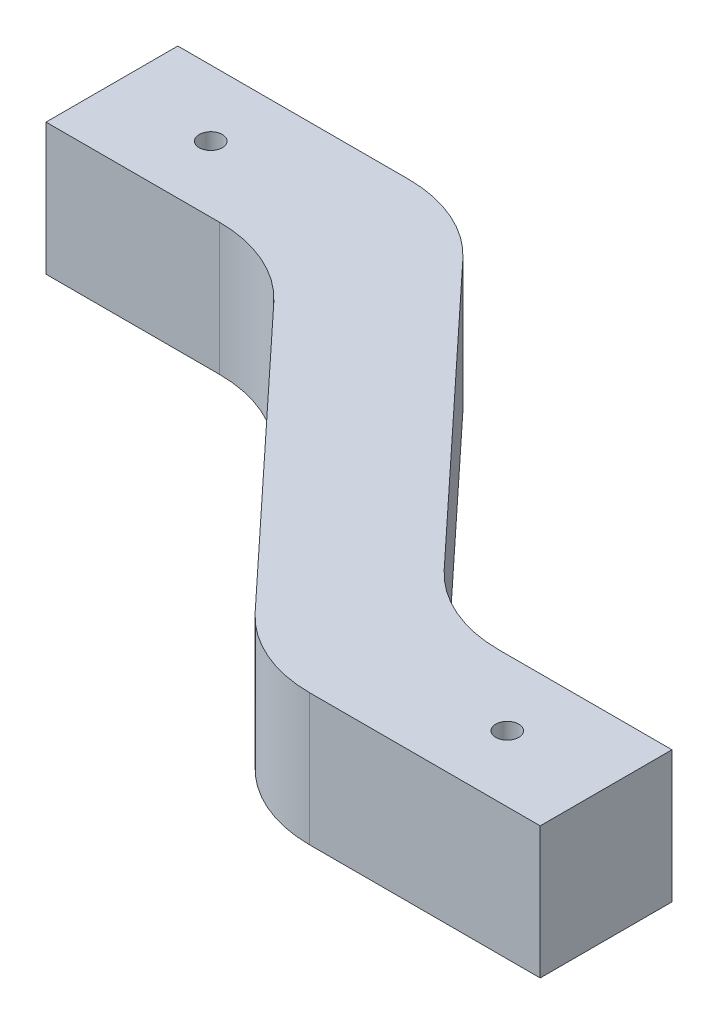
ISO-10303-21;
HEADER;
FILE_DESCRIPTION(('STEP AP214'),'2;1');
FILE_NAME('part.step','',(''),(''),'','','');
FILE_SCHEMA(('AUTOMOTIVE_DESIGN { 1 0 10303 214 1 1 1 1 }'));
ENDSEC;
DATA;
#1=APPLICATION_CONTEXT('core data for automotive mechanical design processes');
#2=APPLICATION_PROTOCOL_DEFINITION('international standard','automotive_design',2000,#1);
#3=PRODUCT_CONTEXT('',#1,'mechanical');
#4=PRODUCT('Part','Part','',(#3));
#5=PRODUCT_RELATED_PRODUCT_CATEGORY('part','',(#4));
#6=PRODUCT_DEFINITION_FORMATION('','',#4);
#7=PRODUCT_DEFINITION_CONTEXT('part definition',#1,'design');
#8=PRODUCT_DEFINITION('design','',#6,#7);
#9=PRODUCT_DEFINITION_SHAPE('','',#8);
#10=(LENGTH_UNIT() NAMED_UNIT(*) SI_UNIT(.MILLI.,.METRE.));
#11=(NAMED_UNIT(*) PLANE_ANGLE_UNIT() SI_UNIT($,.RADIAN.));
#12=(NAMED_UNIT(*) SI_UNIT($,.STERADIAN.) SOLID_ANGLE_UNIT());
#13=UNCERTAINTY_MEASURE_WITH_UNIT(LENGTH_MEASURE(1.E-05),#10,'distance_accuracy_value','');
#14=(GEOMETRIC_REPRESENTATION_CONTEXT(3) GLOBAL_UNCERTAINTY_ASSIGNED_CONTEXT((#13)) GLOBAL_UNIT_ASSIGNED_CONTEXT((#10,
#11,#12)) REPRESENTATION_CONTEXT('',''));
#15=CARTESIAN_POINT('',(0.,0.,0.));
#16=DIRECTION('',(0.,0.,1.));
#17=DIRECTION('',(1.,0.,0.));
#18=AXIS2_PLACEMENT_3D('',#15,#16,#17);
#19=CARTESIAN_POINT('',(0.,20.,0.));
#20=DIRECTION('',(0.,-1.,0.));
#21=DIRECTION('',(0.,0.,-1.));
#22=AXIS2_PLACEMENT_3D('',#19,#20,#21);
#23=PLANE('',#22);
#24=DIRECTION('',(0.682122364496378,0.,0.73123804595622));
#25=VECTOR('',#24,1.);
#26=CARTESIAN_POINT('',(21.3057686956662,20.,75.));
#27=LINE('',#26,#25);
#28=CARTESIAN_POINT('',(-24.0694703852094,20.,26.3575527100725));
#29=VERTEX_POINT('',#28);
#30=CARTESIAN_POINT('',(15.3752390808756,20.,68.6424472899275));
#31=VERTEX_POINT('',#30);
#32=EDGE_CURVE('E139',#29,#31,#27,.T.);
#33=ORIENTED_EDGE('',*,*,#32,.T.);
#34=CARTESIAN_POINT('',(30.,20.,55.));
#35=DIRECTION('',(0.,-1.,0.));
#36=DIRECTION('',(0.,0.,-1.));
#37=AXIS2_PLACEMENT_3D('',#34,#35,#36);
#38=CIRCLE('',#37,20.);
#39=CARTESIAN_POINT('',(30.,20.,75.));
#40=VERTEX_POINT('',#39);
#41=EDGE_CURVE('E174',#31,#40,#38,.F.);
#42=ORIENTED_EDGE('',*,*,#41,.T.);
#43=DIRECTION('',(1.,0.,0.));
#44=VECTOR('',#43,1.);
#45=CARTESIAN_POINT('',(65.,20.,75.));
#46=LINE('',#45,#44);
#47=CARTESIAN_POINT('',(65.,20.,75.));
#48=VERTEX_POINT('',#47);
#49=EDGE_CURVE('E205',#40,#48,#46,.T.);
#50=ORIENTED_EDGE('',*,*,#49,.T.);
#51=DIRECTION('',(0.,0.,-1.));
#52=VECTOR('',#51,1.);
#53=CARTESIAN_POINT('',(65.,20.,55.));
#54=LINE('',#53,#52);
#55=CARTESIAN_POINT('',(65.,20.,55.));
#56=VERTEX_POINT('',#55);
#57=EDGE_CURVE('E207',#48,#56,#54,.T.);
#58=ORIENTED_EDGE('',*,*,#57,.T.);
#59=DIRECTION('',(-1.,0.,0.));
#60=VECTOR('',#59,1.);
#61=CARTESIAN_POINT('',(30.,20.,55.));
#62=LINE('',#61,#60);
#63=CARTESIAN_POINT('',(38.6942313043338,20.,55.));
#64=VERTEX_POINT('',#63);
#65=EDGE_CURVE('E211',#56,#64,#62,.T.);
#66=ORIENTED_EDGE('',*,*,#65,.T.);
#67=CARTESIAN_POINT('',(38.6942313043338,20.,35.));
#68=DIRECTION('',(0.,-1.,0.));
#69=DIRECTION('',(0.,0.,-1.));
#70=AXIS2_PLACEMENT_3D('',#67,#68,#69);
#71=CIRCLE('',#70,20.);
#72=CARTESIAN_POINT('',(24.0694703852094,20.,48.6424472899275));
#73=VERTEX_POINT('',#72);
#74=EDGE_CURVE('E188',#64,#73,#71,.T.);
#75=ORIENTED_EDGE('',*,*,#74,.T.);
#76=DIRECTION('',(-0.682122364496378,0.,-0.73123804595622));
#77=VECTOR('',#76,1.);
#78=CARTESIAN_POINT('',(-21.3057686956662,20.,0.));
#79=LINE('',#78,#77);
#80=CARTESIAN_POINT('',(-15.3752390808756,20.,6.35755271007245));
#81=VERTEX_POINT('',#80);
#82=EDGE_CURVE('E214',#73,#81,#79,.T.);
#83=ORIENTED_EDGE('',*,*,#82,.T.);
#84=CARTESIAN_POINT('',(-30.,20.,20.));
#85=DIRECTION('',(0.,-1.,0.));
#86=DIRECTION('',(0.,0.,-1.));
#87=AXIS2_PLACEMENT_3D('',#84,#85,#86);
#88=CIRCLE('',#87,20.);
#89=CARTESIAN_POINT('',(-30.,20.,0.));
#90=VERTEX_POINT('',#89);
#91=EDGE_CURVE('E54',#81,#90,#88,.F.);
#92=ORIENTED_EDGE('',*,*,#91,.T.);
#93=DIRECTION('',(-1.,0.,0.));
#94=VECTOR('',#93,1.);
#95=CARTESIAN_POINT('',(-65.,20.,0.));
#96=LINE('',#95,#94);
#97=CARTESIAN_POINT('',(-65.,20.,0.));
#98=VERTEX_POINT('',#97);
#99=EDGE_CURVE('E145',#90,#98,#96,.T.);
#100=ORIENTED_EDGE('',*,*,#99,.T.);
#101=DIRECTION('',(0.,0.,1.));
#102=VECTOR('',#101,1.);
#103=CARTESIAN_POINT('',(-65.,20.,20.));
#104=LINE('',#103,#102);
#105=CARTESIAN_POINT('',(-65.,20.,20.));
#106=VERTEX_POINT('',#105);
#107=EDGE_CURVE('E140',#98,#106,#104,.T.);
#108=ORIENTED_EDGE('',*,*,#107,.T.);
#109=DIRECTION('',(1.,0.,0.));
#110=VECTOR('',#109,1.);
#111=CARTESIAN_POINT('',(-30.,20.,20.));
#112=LINE('',#111,#110);
#113=CARTESIAN_POINT('',(-38.6942313043338,20.,20.));
#114=VERTEX_POINT('',#113);
#115=EDGE_CURVE('E129',#106,#114,#112,.T.);
#116=ORIENTED_EDGE('',*,*,#115,.T.);
#117=CARTESIAN_POINT('',(-38.6942313043338,20.,40.));
#118=DIRECTION('',(0.,-1.,0.));
#119=DIRECTION('',(0.,0.,-1.));
#120=AXIS2_PLACEMENT_3D('',#117,#118,#119);
#121=CIRCLE('',#120,20.);
#122=EDGE_CURVE('E11',#114,#29,#121,.T.);
#123=ORIENTED_EDGE('',*,*,#122,.T.);
#124=EDGE_LOOP('',(#33,#42,#50,#58,#66,#75,#83,#92,#100,#108,#116,#123));
#125=FACE_BOUND('',#124,.T.);
#126=CARTESIAN_POINT('',(-50.,20.,10.));
#127=DIRECTION('',(0.,1.,0.));
#128=DIRECTION('',(0.,0.,1.));
#129=AXIS2_PLACEMENT_3D('',#126,#127,#128);
#130=CIRCLE('',#129,1.75);
#131=CARTESIAN_POINT('',(-50.,20.,11.75));
#132=VERTEX_POINT('',#131);
#133=EDGE_CURVE('E218',#132,#132,#130,.T.);
#134=ORIENTED_EDGE('',*,*,#133,.F.);
#135=EDGE_LOOP('',(#134));
#136=FACE_BOUND('',#135,.T.);
#137=CARTESIAN_POINT('',(50.,20.,65.));
#138=DIRECTION('',(0.,1.,0.));
#139=DIRECTION('',(0.,0.,1.));
#140=AXIS2_PLACEMENT_3D('',#137,#138,#139);
#141=CIRCLE('',#140,1.75);
#142=CARTESIAN_POINT('',(50.,20.,66.75));
#143=VERTEX_POINT('',#142);
#144=EDGE_CURVE('E283',#143,#143,#141,.T.);
#145=ORIENTED_EDGE('',*,*,#144,.F.);
#146=EDGE_LOOP('',(#145));
#147=FACE_BOUND('',#146,.T.);
#148=ADVANCED_FACE('F39',(#125,#136,#147),#23,.F.);
#149=CARTESIAN_POINT('',(0.,0.,0.));
#150=DIRECTION('',(0.,-1.,0.));
#151=DIRECTION('',(0.,0.,-1.));
#152=AXIS2_PLACEMENT_3D('',#149,#150,#151);
#153=PLANE('',#152);
#154=CARTESIAN_POINT('',(-50.,0.,10.));
#155=DIRECTION('',(0.,1.,0.));
#156=DIRECTION('',(0.,0.,1.));
#157=AXIS2_PLACEMENT_3D('',#154,#155,#156);
#158=CIRCLE('',#157,1.75);
#159=CARTESIAN_POINT('',(-50.,0.,11.75));
#160=VERTEX_POINT('',#159);
#161=EDGE_CURVE('E288',#160,#160,#158,.T.);
#162=ORIENTED_EDGE('',*,*,#161,.T.);
#163=EDGE_LOOP('',(#162));
#164=FACE_BOUND('',#163,.T.);
#165=DIRECTION('',(1.,0.,0.));
#166=VECTOR('',#165,1.);
#167=CARTESIAN_POINT('',(65.,0.,75.));
#168=LINE('',#167,#166);
#169=CARTESIAN_POINT('',(30.,0.,75.));
#170=VERTEX_POINT('',#169);
#171=CARTESIAN_POINT('',(65.,0.,75.));
#172=VERTEX_POINT('',#171);
#173=EDGE_CURVE('E221',#170,#172,#168,.T.);
#174=ORIENTED_EDGE('',*,*,#173,.F.);
#175=CARTESIAN_POINT('',(30.,0.,55.));
#176=DIRECTION('',(0.,-1.,0.));
#177=DIRECTION('',(0.,0.,-1.));
#178=AXIS2_PLACEMENT_3D('',#175,#176,#177);
#179=CIRCLE('',#178,20.);
#180=CARTESIAN_POINT('',(15.3752390808756,0.,68.6424472899275));
#181=VERTEX_POINT('',#180);
#182=EDGE_CURVE('E166',#170,#181,#179,.T.);
#183=ORIENTED_EDGE('',*,*,#182,.T.);
#184=DIRECTION('',(0.682122364496378,0.,0.73123804595622));
#185=VECTOR('',#184,1.);
#186=CARTESIAN_POINT('',(21.3057686956662,0.,75.));
#187=LINE('',#186,#185);
#188=CARTESIAN_POINT('',(-24.0694703852094,0.,26.3575527100725));
#189=VERTEX_POINT('',#188);
#190=EDGE_CURVE('E196',#189,#181,#187,.T.);
#191=ORIENTED_EDGE('',*,*,#190,.F.);
#192=CARTESIAN_POINT('',(-38.6942313043338,0.,40.));
#193=DIRECTION('',(0.,-1.,0.));
#194=DIRECTION('',(0.,0.,-1.));
#195=AXIS2_PLACEMENT_3D('',#192,#193,#194);
#196=CIRCLE('',#195,20.);
#197=CARTESIAN_POINT('',(-38.6942313043338,0.,20.));
#198=VERTEX_POINT('',#197);
#199=EDGE_CURVE('E47',#189,#198,#196,.F.);
#200=ORIENTED_EDGE('',*,*,#199,.T.);
#201=DIRECTION('',(1.,0.,0.));
#202=VECTOR('',#201,1.);
#203=CARTESIAN_POINT('',(-30.,0.,20.));
#204=LINE('',#203,#202);
#205=CARTESIAN_POINT('',(-65.,0.,20.));
#206=VERTEX_POINT('',#205);
#207=EDGE_CURVE('E194',#206,#198,#204,.T.);
#208=ORIENTED_EDGE('',*,*,#207,.F.);
#209=DIRECTION('',(0.,0.,1.));
#210=VECTOR('',#209,1.);
#211=CARTESIAN_POINT('',(-65.,0.,20.));
#212=LINE('',#211,#210);
#213=CARTESIAN_POINT('',(-65.,0.,0.));
#214=VERTEX_POINT('',#213);
#215=EDGE_CURVE('E153',#214,#206,#212,.T.);
#216=ORIENTED_EDGE('',*,*,#215,.F.);
#217=DIRECTION('',(-1.,0.,0.));
#218=VECTOR('',#217,1.);
#219=CARTESIAN_POINT('',(-65.,0.,0.));
#220=LINE('',#219,#218);
#221=CARTESIAN_POINT('',(-30.,0.,0.));
#222=VERTEX_POINT('',#221);
#223=EDGE_CURVE('E149',#222,#214,#220,.T.);
#224=ORIENTED_EDGE('',*,*,#223,.F.);
#225=CARTESIAN_POINT('',(-30.,0.,20.));
#226=DIRECTION('',(0.,-1.,0.));
#227=DIRECTION('',(0.,0.,-1.));
#228=AXIS2_PLACEMENT_3D('',#225,#226,#227);
#229=CIRCLE('',#228,20.);
#230=CARTESIAN_POINT('',(-15.3752390808756,0.,6.35755271007245));
#231=VERTEX_POINT('',#230);
#232=EDGE_CURVE('E158',#222,#231,#229,.T.);
#233=ORIENTED_EDGE('',*,*,#232,.T.);
#234=DIRECTION('',(-0.682122364496378,0.,-0.73123804595622));
#235=VECTOR('',#234,1.);
#236=CARTESIAN_POINT('',(-21.3057686956662,0.,0.));
#237=LINE('',#236,#235);
#238=CARTESIAN_POINT('',(24.0694703852094,0.,48.6424472899275));
#239=VERTEX_POINT('',#238);
#240=EDGE_CURVE('E228',#239,#231,#237,.T.);
#241=ORIENTED_EDGE('',*,*,#240,.F.);
#242=CARTESIAN_POINT('',(38.6942313043338,0.,35.));
#243=DIRECTION('',(0.,-1.,0.));
#244=DIRECTION('',(0.,0.,-1.));
#245=AXIS2_PLACEMENT_3D('',#242,#243,#244);
#246=CIRCLE('',#245,20.);
#247=CARTESIAN_POINT('',(38.6942313043338,0.,55.));
#248=VERTEX_POINT('',#247);
#249=EDGE_CURVE('E186',#239,#248,#246,.F.);
#250=ORIENTED_EDGE('',*,*,#249,.T.);
#251=DIRECTION('',(-1.,0.,0.));
#252=VECTOR('',#251,1.);
#253=CARTESIAN_POINT('',(30.,0.,55.));
#254=LINE('',#253,#252);
#255=CARTESIAN_POINT('',(65.,0.,55.));
#256=VERTEX_POINT('',#255);
#257=EDGE_CURVE('E225',#256,#248,#254,.T.);
#258=ORIENTED_EDGE('',*,*,#257,.F.);
#259=DIRECTION('',(0.,0.,-1.));
#260=VECTOR('',#259,1.);
#261=CARTESIAN_POINT('',(65.,0.,55.));
#262=LINE('',#261,#260);
#263=EDGE_CURVE('E223',#172,#256,#262,.T.);
#264=ORIENTED_EDGE('',*,*,#263,.F.);
#265=EDGE_LOOP('',(#174,#183,#191,#200,#208,#216,#224,#233,#241,#250,#258,#264));
#266=FACE_BOUND('',#265,.T.);
#267=CARTESIAN_POINT('',(50.,0.,65.));
#268=DIRECTION('',(0.,1.,0.));
#269=DIRECTION('',(0.,0.,1.));
#270=AXIS2_PLACEMENT_3D('',#267,#268,#269);
#271=CIRCLE('',#270,1.75);
#272=CARTESIAN_POINT('',(50.,0.,66.75));
#273=VERTEX_POINT('',#272);
#274=EDGE_CURVE('E286',#273,#273,#271,.T.);
#275=ORIENTED_EDGE('',*,*,#274,.T.);
#276=EDGE_LOOP('',(#275));
#277=FACE_BOUND('',#276,.T.);
#278=ADVANCED_FACE('F192',(#164,#266,#277),#153,.T.);
#279=CARTESIAN_POINT('',(-65.,20.,20.));
#280=DIRECTION('',(1.,0.,0.));
#281=DIRECTION('',(0.,0.,-1.));
#282=AXIS2_PLACEMENT_3D('',#279,#280,#281);
#283=PLANE('',#282);
#284=ORIENTED_EDGE('',*,*,#215,.T.);
#285=DIRECTION('',(0.,-1.,0.));
#286=VECTOR('',#285,1.);
#287=CARTESIAN_POINT('',(-65.,20.,20.));
#288=LINE('',#287,#286);
#289=EDGE_CURVE('E134',#106,#206,#288,.T.);
#290=ORIENTED_EDGE('',*,*,#289,.F.);
#291=ORIENTED_EDGE('',*,*,#107,.F.);
#292=DIRECTION('',(0.,-1.,0.));
#293=VECTOR('',#292,1.);
#294=CARTESIAN_POINT('',(-65.,20.,0.));
#295=LINE('',#294,#293);
#296=EDGE_CURVE('E217',#98,#214,#295,.T.);
#297=ORIENTED_EDGE('',*,*,#296,.T.);
#298=EDGE_LOOP('',(#284,#290,#291,#297));
#299=FACE_BOUND('',#298,.T.);
#300=ADVANCED_FACE('F151',(#299),#283,.F.);
#301=CARTESIAN_POINT('',(-30.,20.,20.));
#302=DIRECTION('',(0.,0.,-1.));
#303=DIRECTION('',(-1.,0.,0.));
#304=AXIS2_PLACEMENT_3D('',#301,#302,#303);
#305=PLANE('',#304);
#306=ORIENTED_EDGE('',*,*,#207,.T.);
#307=DIRECTION('',(0.,-1.,0.));
#308=VECTOR('',#307,1.);
#309=CARTESIAN_POINT('',(-38.6942313043338,20.,20.));
#310=LINE('',#309,#308);
#311=EDGE_CURVE('E137',#198,#114,#310,.F.);
#312=ORIENTED_EDGE('',*,*,#311,.T.);
#313=ORIENTED_EDGE('',*,*,#115,.F.);
#314=ORIENTED_EDGE('',*,*,#289,.T.);
#315=EDGE_LOOP('',(#306,#312,#313,#314));
#316=FACE_BOUND('',#315,.T.);
#317=ADVANCED_FACE('F132',(#316),#305,.F.);
#318=CARTESIAN_POINT('',(21.3057686956662,20.,75.));
#319=DIRECTION('',(0.73123804595622,0.,-0.682122364496378));
#320=DIRECTION('',(-0.682122364496378,0.,-0.73123804595622));
#321=AXIS2_PLACEMENT_3D('',#318,#319,#320);
#322=PLANE('',#321);
#323=ORIENTED_EDGE('',*,*,#190,.T.);
#324=DIRECTION('',(0.,-1.,0.));
#325=VECTOR('',#324,1.);
#326=CARTESIAN_POINT('',(15.3752390808756,20.,68.6424472899275));
#327=LINE('',#326,#325);
#328=EDGE_CURVE('E171',#181,#31,#327,.F.);
#329=ORIENTED_EDGE('',*,*,#328,.T.);
#330=ORIENTED_EDGE('',*,*,#32,.F.);
#331=DIRECTION('',(0.,-1.,0.));
#332=VECTOR('',#331,1.);
#333=CARTESIAN_POINT('',(-24.0694703852094,0.,26.3575527100725));
#334=LINE('',#333,#332);
#335=EDGE_CURVE('E168',#29,#189,#334,.T.);
#336=ORIENTED_EDGE('',*,*,#335,.T.);
#337=EDGE_LOOP('',(#323,#329,#330,#336));
#338=FACE_BOUND('',#337,.T.);
#339=ADVANCED_FACE('F203',(#338),#322,.F.);
#340=CARTESIAN_POINT('',(65.,20.,75.));
#341=DIRECTION('',(0.,0.,-1.));
#342=DIRECTION('',(-1.,0.,0.));
#343=AXIS2_PLACEMENT_3D('',#340,#341,#342);
#344=PLANE('',#343);
#345=ORIENTED_EDGE('',*,*,#49,.F.);
#346=DIRECTION('',(0.,-1.,0.));
#347=VECTOR('',#346,1.);
#348=CARTESIAN_POINT('',(30.,20.,75.));
#349=LINE('',#348,#347);
#350=EDGE_CURVE('E154',#40,#170,#349,.T.);
#351=ORIENTED_EDGE('',*,*,#350,.T.);
#352=ORIENTED_EDGE('',*,*,#173,.T.);
#353=DIRECTION('',(0.,-1.,0.));
#354=VECTOR('',#353,1.);
#355=CARTESIAN_POINT('',(65.,20.,75.));
#356=LINE('',#355,#354);
#357=EDGE_CURVE('E155',#48,#172,#356,.T.);
#358=ORIENTED_EDGE('',*,*,#357,.F.);
#359=EDGE_LOOP('',(#345,#351,#352,#358));
#360=FACE_BOUND('',#359,.T.);
#361=ADVANCED_FACE('F364',(#360),#344,.F.);
#362=CARTESIAN_POINT('',(65.,20.,55.));
#363=DIRECTION('',(-1.,0.,0.));
#364=DIRECTION('',(0.,0.,1.));
#365=AXIS2_PLACEMENT_3D('',#362,#363,#364);
#366=PLANE('',#365);
#367=ORIENTED_EDGE('',*,*,#263,.T.);
#368=DIRECTION('',(0.,-1.,0.));
#369=VECTOR('',#368,1.);
#370=CARTESIAN_POINT('',(65.,20.,55.));
#371=LINE('',#370,#369);
#372=EDGE_CURVE('E161',#56,#256,#371,.T.);
#373=ORIENTED_EDGE('',*,*,#372,.F.);
#374=ORIENTED_EDGE('',*,*,#57,.F.);
#375=ORIENTED_EDGE('',*,*,#357,.T.);
#376=EDGE_LOOP('',(#367,#373,#374,#375));
#377=FACE_BOUND('',#376,.T.);
#378=ADVANCED_FACE('F355',(#377),#366,.F.);
#379=CARTESIAN_POINT('',(30.,20.,55.));
#380=DIRECTION('',(0.,0.,1.));
#381=DIRECTION('',(1.,0.,0.));
#382=AXIS2_PLACEMENT_3D('',#379,#380,#381);
#383=PLANE('',#382);
#384=ORIENTED_EDGE('',*,*,#257,.T.);
#385=DIRECTION('',(0.,-1.,0.));
#386=VECTOR('',#385,1.);
#387=CARTESIAN_POINT('',(38.6942313043338,20.,55.));
#388=LINE('',#387,#386);
#389=EDGE_CURVE('E180',#248,#64,#388,.F.);
#390=ORIENTED_EDGE('',*,*,#389,.T.);
#391=ORIENTED_EDGE('',*,*,#65,.F.);
#392=ORIENTED_EDGE('',*,*,#372,.T.);
#393=EDGE_LOOP('',(#384,#390,#391,#392));
#394=FACE_BOUND('',#393,.T.);
#395=ADVANCED_FACE('F236',(#394),#383,.F.);
#396=CARTESIAN_POINT('',(-21.3057686956662,20.,0.));
#397=DIRECTION('',(-0.73123804595622,0.,0.682122364496378));
#398=DIRECTION('',(0.682122364496378,0.,0.73123804595622));
#399=AXIS2_PLACEMENT_3D('',#396,#397,#398);
#400=PLANE('',#399);
#401=ORIENTED_EDGE('',*,*,#82,.F.);
#402=DIRECTION('',(0.,-1.,0.));
#403=VECTOR('',#402,1.);
#404=CARTESIAN_POINT('',(24.0694703852094,0.,48.6424472899275));
#405=LINE('',#404,#403);
#406=EDGE_CURVE('E177',#73,#239,#405,.T.);
#407=ORIENTED_EDGE('',*,*,#406,.T.);
#408=ORIENTED_EDGE('',*,*,#240,.T.);
#409=DIRECTION('',(0.,-1.,0.));
#410=VECTOR('',#409,1.);
#411=CARTESIAN_POINT('',(-15.3752390808756,20.,6.35755271007245));
#412=LINE('',#411,#410);
#413=EDGE_CURVE('E62',#231,#81,#412,.F.);
#414=ORIENTED_EDGE('',*,*,#413,.T.);
#415=EDGE_LOOP('',(#401,#407,#408,#414));
#416=FACE_BOUND('',#415,.T.);
#417=ADVANCED_FACE('F246',(#416),#400,.F.);
#418=CARTESIAN_POINT('',(-65.,20.,0.));
#419=DIRECTION('',(0.,0.,1.));
#420=DIRECTION('',(1.,0.,0.));
#421=AXIS2_PLACEMENT_3D('',#418,#419,#420);
#422=PLANE('',#421);
#423=ORIENTED_EDGE('',*,*,#99,.F.);
#424=DIRECTION('',(0.,-1.,0.));
#425=VECTOR('',#424,1.);
#426=CARTESIAN_POINT('',(-30.,20.,0.));
#427=LINE('',#426,#425);
#428=EDGE_CURVE('E182',#90,#222,#427,.T.);
#429=ORIENTED_EDGE('',*,*,#428,.T.);
#430=ORIENTED_EDGE('',*,*,#223,.T.);
#431=ORIENTED_EDGE('',*,*,#296,.F.);
#432=EDGE_LOOP('',(#423,#429,#430,#431));
#433=FACE_BOUND('',#432,.T.);
#434=ADVANCED_FACE('F252',(#433),#422,.F.);
#435=CARTESIAN_POINT('',(-50.,20.,10.));
#436=DIRECTION('',(0.,-1.,0.));
#437=DIRECTION('',(0.,0.,-1.));
#438=AXIS2_PLACEMENT_3D('',#435,#436,#437);
#439=CYLINDRICAL_SURFACE('',#438,1.75);
#440=ORIENTED_EDGE('',*,*,#133,.T.);
#441=EDGE_LOOP('',(#440));
#442=FACE_BOUND('',#441,.T.);
#443=ORIENTED_EDGE('',*,*,#161,.F.);
#444=EDGE_LOOP('',(#443));
#445=FACE_BOUND('',#444,.T.);
#446=ADVANCED_FACE('F254',(#442,#445),#439,.F.);
#447=CARTESIAN_POINT('',(50.,20.,65.));
#448=DIRECTION('',(0.,-1.,0.));
#449=DIRECTION('',(0.,0.,-1.));
#450=AXIS2_PLACEMENT_3D('',#447,#448,#449);
#451=CYLINDRICAL_SURFACE('',#450,1.75);
#452=ORIENTED_EDGE('',*,*,#144,.T.);
#453=EDGE_LOOP('',(#452));
#454=FACE_BOUND('',#453,.T.);
#455=ORIENTED_EDGE('',*,*,#274,.F.);
#456=EDGE_LOOP('',(#455));
#457=FACE_BOUND('',#456,.T.);
#458=ADVANCED_FACE('F261',(#454,#457),#451,.F.);
#459=CARTESIAN_POINT('',(30.,20.,55.));
#460=DIRECTION('',(0.,-1.,0.));
#461=DIRECTION('',(0.,0.,-1.));
#462=AXIS2_PLACEMENT_3D('',#459,#460,#461);
#463=CYLINDRICAL_SURFACE('',#462,20.);
#464=ORIENTED_EDGE('',*,*,#41,.F.);
#465=ORIENTED_EDGE('',*,*,#328,.F.);
#466=ORIENTED_EDGE('',*,*,#182,.F.);
#467=ORIENTED_EDGE('',*,*,#350,.F.);
#468=EDGE_LOOP('',(#464,#465,#466,#467));
#469=FACE_BOUND('',#468,.T.);
#470=ADVANCED_FACE('F274',(#469),#463,.T.);
#471=CARTESIAN_POINT('',(38.6942313043338,20.,35.));
#472=DIRECTION('',(0.,1.,0.));
#473=DIRECTION('',(0.,0.,1.));
#474=AXIS2_PLACEMENT_3D('',#471,#472,#473);
#475=CYLINDRICAL_SURFACE('',#474,20.);
#476=ORIENTED_EDGE('',*,*,#74,.F.);
#477=ORIENTED_EDGE('',*,*,#389,.F.);
#478=ORIENTED_EDGE('',*,*,#249,.F.);
#479=ORIENTED_EDGE('',*,*,#406,.F.);
#480=EDGE_LOOP('',(#476,#477,#478,#479));
#481=FACE_BOUND('',#480,.T.);
#482=ADVANCED_FACE('F245',(#481),#475,.F.);
#483=CARTESIAN_POINT('',(-30.,20.,20.));
#484=DIRECTION('',(0.,-1.,0.));
#485=DIRECTION('',(0.,0.,-1.));
#486=AXIS2_PLACEMENT_3D('',#483,#484,#485);
#487=CYLINDRICAL_SURFACE('',#486,20.);
#488=ORIENTED_EDGE('',*,*,#91,.F.);
#489=ORIENTED_EDGE('',*,*,#413,.F.);
#490=ORIENTED_EDGE('',*,*,#232,.F.);
#491=ORIENTED_EDGE('',*,*,#428,.F.);
#492=EDGE_LOOP('',(#488,#489,#490,#491));
#493=FACE_BOUND('',#492,.T.);
#494=ADVANCED_FACE('F249',(#493),#487,.T.);
#495=CARTESIAN_POINT('',(-38.6942313043338,20.,40.));
#496=DIRECTION('',(0.,1.,0.));
#497=DIRECTION('',(0.,0.,1.));
#498=AXIS2_PLACEMENT_3D('',#495,#496,#497);
#499=CYLINDRICAL_SURFACE('',#498,20.);
#500=ORIENTED_EDGE('',*,*,#122,.F.);
#501=ORIENTED_EDGE('',*,*,#311,.F.);
#502=ORIENTED_EDGE('',*,*,#199,.F.);
#503=ORIENTED_EDGE('',*,*,#335,.F.);
#504=EDGE_LOOP('',(#500,#501,#502,#503));
#505=FACE_BOUND('',#504,.T.);
#506=ADVANCED_FACE('F41',(#505),#499,.F.);
#507=CLOSED_SHELL('',(#148,#278,#300,#317,#339,#361,#378,#395,#417,#434,#446,#458,#470,#482,
#494,#506));
#508=MANIFOLD_SOLID_BREP('B2',#507);
#509=ADVANCED_BREP_SHAPE_REPRESENTATION('',(#18,#508),#14);
#510=SHAPE_DEFINITION_REPRESENTATION(#9,#509);
ENDSEC;
END-ISO-10303-21;
